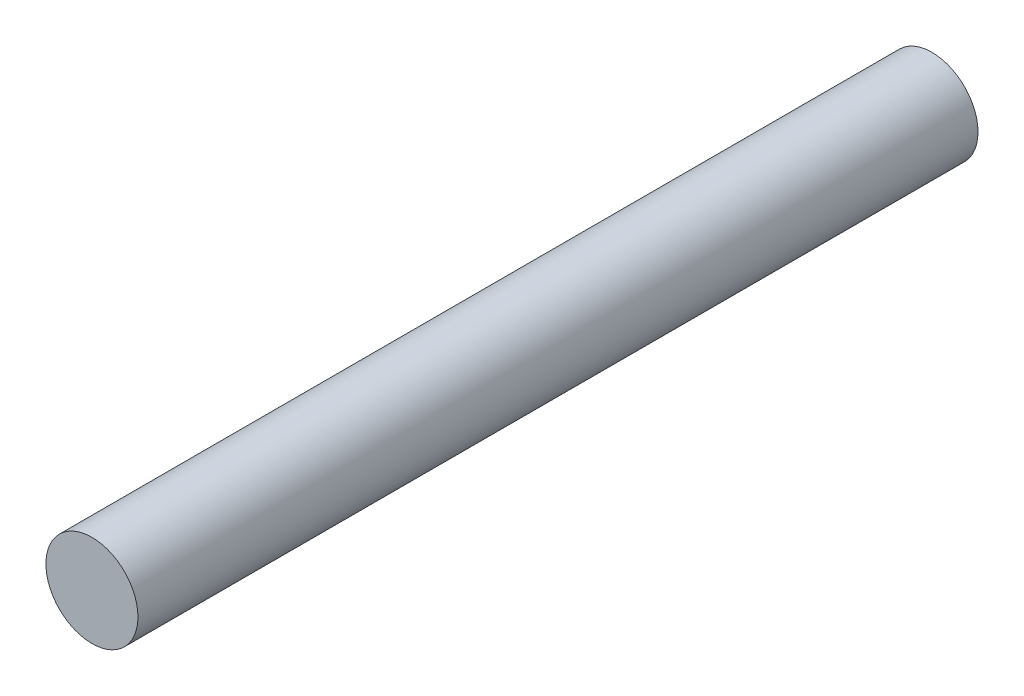
ISO-10303-21;
HEADER;
FILE_DESCRIPTION(('STEP AP214'),'2;1');
FILE_NAME('part.step','',(''),(''),'','','');
FILE_SCHEMA(('AUTOMOTIVE_DESIGN { 1 0 10303 214 1 1 1 1 }'));
ENDSEC;
DATA;
#1=APPLICATION_CONTEXT('core data for automotive mechanical design processes');
#2=APPLICATION_PROTOCOL_DEFINITION('international standard','automotive_design',2000,#1);
#3=PRODUCT_CONTEXT('',#1,'mechanical');
#4=PRODUCT('Part','Part','',(#3));
#5=PRODUCT_RELATED_PRODUCT_CATEGORY('part','',(#4));
#6=PRODUCT_DEFINITION_FORMATION('','',#4);
#7=PRODUCT_DEFINITION_CONTEXT('part definition',#1,'design');
#8=PRODUCT_DEFINITION('design','',#6,#7);
#9=PRODUCT_DEFINITION_SHAPE('','',#8);
#10=(LENGTH_UNIT() NAMED_UNIT(*) SI_UNIT(.MILLI.,.METRE.));
#11=(NAMED_UNIT(*) PLANE_ANGLE_UNIT() SI_UNIT($,.RADIAN.));
#12=(NAMED_UNIT(*) SI_UNIT($,.STERADIAN.) SOLID_ANGLE_UNIT());
#13=UNCERTAINTY_MEASURE_WITH_UNIT(LENGTH_MEASURE(1.E-05),#10,'distance_accuracy_value','');
#14=(GEOMETRIC_REPRESENTATION_CONTEXT(3) GLOBAL_UNCERTAINTY_ASSIGNED_CONTEXT((#13)) GLOBAL_UNIT_ASSIGNED_CONTEXT((#10,
#11,#12)) REPRESENTATION_CONTEXT('',''));
#15=CARTESIAN_POINT('',(0.,0.,0.));
#16=DIRECTION('',(0.,0.,1.));
#17=DIRECTION('',(1.,0.,0.));
#18=AXIS2_PLACEMENT_3D('',#15,#16,#17);
#19=CARTESIAN_POINT('',(0.,0.,14.6));
#20=DIRECTION('',(0.,0.,-1.));
#21=DIRECTION('',(-1.,0.,0.));
#22=AXIS2_PLACEMENT_3D('',#19,#20,#21);
#23=CYLINDRICAL_SURFACE('',#22,0.8);
#24=CARTESIAN_POINT('',(0.,0.,14.6));
#25=DIRECTION('',(0.,0.,1.));
#26=DIRECTION('',(1.,0.,0.));
#27=AXIS2_PLACEMENT_3D('',#24,#25,#26);
#28=CIRCLE('',#27,0.8);
#29=CARTESIAN_POINT('',(0.8,0.,14.6));
#30=VERTEX_POINT('',#29);
#31=EDGE_CURVE('E10',#30,#30,#28,.T.);
#32=ORIENTED_EDGE('',*,*,#31,.F.);
#33=EDGE_LOOP('',(#32));
#34=FACE_BOUND('',#33,.T.);
#35=CARTESIAN_POINT('',(0.,0.,0.));
#36=DIRECTION('',(0.,0.,1.));
#37=DIRECTION('',(1.,0.,0.));
#38=AXIS2_PLACEMENT_3D('',#35,#36,#37);
#39=CIRCLE('',#38,0.8);
#40=CARTESIAN_POINT('',(0.8,0.,0.));
#41=VERTEX_POINT('',#40);
#42=EDGE_CURVE('E38',#41,#41,#39,.T.);
#43=ORIENTED_EDGE('',*,*,#42,.T.);
#44=EDGE_LOOP('',(#43));
#45=FACE_BOUND('',#44,.T.);
#46=ADVANCED_FACE('F35',(#34,#45),#23,.T.);
#47=CARTESIAN_POINT('',(0.,0.,14.6));
#48=DIRECTION('',(0.,0.,1.));
#49=DIRECTION('',(1.,0.,0.));
#50=AXIS2_PLACEMENT_3D('',#47,#48,#49);
#51=PLANE('',#50);
#52=ORIENTED_EDGE('',*,*,#31,.T.);
#53=EDGE_LOOP('',(#52));
#54=FACE_BOUND('',#53,.T.);
#55=ADVANCED_FACE('F50',(#54),#51,.T.);
#56=CARTESIAN_POINT('',(0.,0.,0.));
#57=DIRECTION('',(0.,0.,1.));
#58=DIRECTION('',(1.,0.,0.));
#59=AXIS2_PLACEMENT_3D('',#56,#57,#58);
#60=PLANE('',#59);
#61=ORIENTED_EDGE('',*,*,#42,.F.);
#62=EDGE_LOOP('',(#61));
#63=FACE_BOUND('',#62,.T.);
#64=ADVANCED_FACE('F48',(#63),#60,.F.);
#65=CLOSED_SHELL('',(#46,#55,#64));
#66=MANIFOLD_SOLID_BREP('B2',#65);
#67=ADVANCED_BREP_SHAPE_REPRESENTATION('',(#18,#66),#14);
#68=SHAPE_DEFINITION_REPRESENTATION(#9,#67);
ENDSEC;
END-ISO-10303-21;
